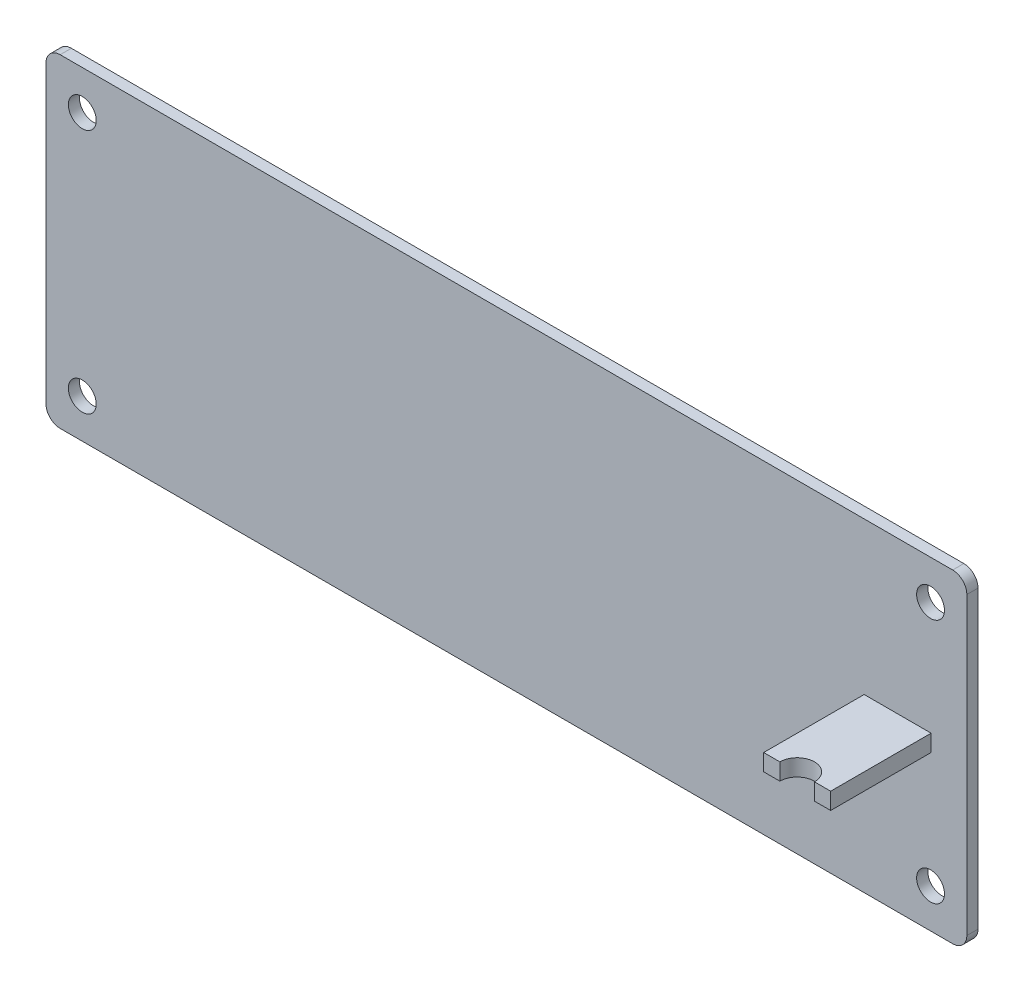
ISO-10303-21;
HEADER;
FILE_DESCRIPTION(('STEP AP214'),'2;1');
FILE_NAME('part.step','',(''),(''),'','','');
FILE_SCHEMA(('AUTOMOTIVE_DESIGN { 1 0 10303 214 1 1 1 1 }'));
ENDSEC;
DATA;
#1=APPLICATION_CONTEXT('core data for automotive mechanical design processes');
#2=APPLICATION_PROTOCOL_DEFINITION('international standard','automotive_design',2000,#1);
#3=PRODUCT_CONTEXT('',#1,'mechanical');
#4=PRODUCT('Part','Part','',(#3));
#5=PRODUCT_RELATED_PRODUCT_CATEGORY('part','',(#4));
#6=PRODUCT_DEFINITION_FORMATION('','',#4);
#7=PRODUCT_DEFINITION_CONTEXT('part definition',#1,'design');
#8=PRODUCT_DEFINITION('design','',#6,#7);
#9=PRODUCT_DEFINITION_SHAPE('','',#8);
#10=(LENGTH_UNIT() NAMED_UNIT(*) SI_UNIT(.MILLI.,.METRE.));
#11=(NAMED_UNIT(*) PLANE_ANGLE_UNIT() SI_UNIT($,.RADIAN.));
#12=(NAMED_UNIT(*) SI_UNIT($,.STERADIAN.) SOLID_ANGLE_UNIT());
#13=UNCERTAINTY_MEASURE_WITH_UNIT(LENGTH_MEASURE(1.E-05),#10,'distance_accuracy_value','');
#14=(GEOMETRIC_REPRESENTATION_CONTEXT(3) GLOBAL_UNCERTAINTY_ASSIGNED_CONTEXT((#13)) GLOBAL_UNIT_ASSIGNED_CONTEXT((#10,
#11,#12)) REPRESENTATION_CONTEXT('',''));
#15=CARTESIAN_POINT('',(0.,0.,0.));
#16=DIRECTION('',(0.,0.,1.));
#17=DIRECTION('',(1.,0.,0.));
#18=AXIS2_PLACEMENT_3D('',#15,#16,#17);
#19=CARTESIAN_POINT('',(79.2998064813246,15.3727846275138,1.00000000000006));
#20=DIRECTION('',(1.,0.,0.));
#21=DIRECTION('',(0.,0.,-1.));
#22=AXIS2_PLACEMENT_3D('',#19,#20,#21);
#23=PLANE('',#22);
#24=DIRECTION('',(0.,0.,1.));
#25=VECTOR('',#24,1.);
#26=CARTESIAN_POINT('',(79.2998064813246,15.3727846275138,1.00000000000006));
#27=LINE('',#26,#25);
#28=CARTESIAN_POINT('',(79.2998064813246,15.3727846275138,10.0000000000006));
#29=VERTEX_POINT('',#28);
#30=CARTESIAN_POINT('',(79.2998064813246,15.3727846275138,1.00000000000006));
#31=VERTEX_POINT('',#30);
#32=EDGE_CURVE('E138',#29,#31,#27,.F.);
#33=ORIENTED_EDGE('',*,*,#32,.F.);
#34=DIRECTION('',(0.,1.,0.));
#35=VECTOR('',#34,1.);
#36=CARTESIAN_POINT('',(79.2998064813246,15.3727846275138,10.0000000000006));
#37=LINE('',#36,#35);
#38=CARTESIAN_POINT('',(79.2998064813246,13.8727846275147,10.0000000000006));
#39=VERTEX_POINT('',#38);
#40=EDGE_CURVE('E252',#29,#39,#37,.F.);
#41=ORIENTED_EDGE('',*,*,#40,.T.);
#42=DIRECTION('',(0.,0.,-1.));
#43=VECTOR('',#42,1.);
#44=CARTESIAN_POINT('',(79.2998064813246,13.8727846275147,1.00000000000006));
#45=LINE('',#44,#43);
#46=CARTESIAN_POINT('',(79.2998064813246,13.8727846275147,1.00000000000006));
#47=VERTEX_POINT('',#46);
#48=EDGE_CURVE('E139',#47,#39,#45,.F.);
#49=ORIENTED_EDGE('',*,*,#48,.F.);
#50=DIRECTION('',(0.,1.,0.));
#51=VECTOR('',#50,1.);
#52=CARTESIAN_POINT('',(79.2998064813246,15.3727846275138,1.00000000000006));
#53=LINE('',#52,#51);
#54=EDGE_CURVE('E135',#47,#31,#53,.T.);
#55=ORIENTED_EDGE('',*,*,#54,.T.);
#56=EDGE_LOOP('',(#33,#41,#49,#55));
#57=FACE_BOUND('',#56,.T.);
#58=ADVANCED_FACE('F19',(#57),#23,.T.);
#59=CARTESIAN_POINT('',(73.2998064813232,13.8727846275147,1.00000000000006));
#60=DIRECTION('',(-1.,0.,0.));
#61=DIRECTION('',(0.,0.,1.));
#62=AXIS2_PLACEMENT_3D('',#59,#60,#61);
#63=PLANE('',#62);
#64=DIRECTION('',(0.,0.,-1.));
#65=VECTOR('',#64,1.);
#66=CARTESIAN_POINT('',(73.2998064813232,13.8727846275147,1.00000000000006));
#67=LINE('',#66,#65);
#68=CARTESIAN_POINT('',(73.2998064813232,13.8727846275147,10.0000000000006));
#69=VERTEX_POINT('',#68);
#70=CARTESIAN_POINT('',(73.2998064813232,13.8727846275147,1.00000000000006));
#71=VERTEX_POINT('',#70);
#72=EDGE_CURVE('E174',#69,#71,#67,.T.);
#73=ORIENTED_EDGE('',*,*,#72,.F.);
#74=DIRECTION('',(0.,1.,0.));
#75=VECTOR('',#74,1.);
#76=CARTESIAN_POINT('',(73.2998064813232,15.3727846275138,10.0000000000006));
#77=LINE('',#76,#75);
#78=CARTESIAN_POINT('',(73.2998064813232,15.3727846275138,10.0000000000006));
#79=VERTEX_POINT('',#78);
#80=EDGE_CURVE('E117',#69,#79,#77,.T.);
#81=ORIENTED_EDGE('',*,*,#80,.T.);
#82=DIRECTION('',(0.,0.,1.));
#83=VECTOR('',#82,1.);
#84=CARTESIAN_POINT('',(73.2998064813232,15.3727846275138,1.00000000000006));
#85=LINE('',#84,#83);
#86=CARTESIAN_POINT('',(73.2998064813232,15.3727846275138,1.00000000000006));
#87=VERTEX_POINT('',#86);
#88=EDGE_CURVE('E153',#87,#79,#85,.T.);
#89=ORIENTED_EDGE('',*,*,#88,.F.);
#90=DIRECTION('',(0.,1.,0.));
#91=VECTOR('',#90,1.);
#92=CARTESIAN_POINT('',(73.2998064813232,13.8727846275147,1.00000000000006));
#93=LINE('',#92,#91);
#94=EDGE_CURVE('E144',#87,#71,#93,.F.);
#95=ORIENTED_EDGE('',*,*,#94,.T.);
#96=EDGE_LOOP('',(#73,#81,#89,#95));
#97=FACE_BOUND('',#96,.T.);
#98=ADVANCED_FACE('F265',(#97),#63,.T.);
#99=CARTESIAN_POINT('',(81.85100113384,15.3727846275138,10.0000000000006));
#100=DIRECTION('',(0.,0.,-1.));
#101=DIRECTION('',(-1.,0.,0.));
#102=AXIS2_PLACEMENT_3D('',#99,#100,#101);
#103=PLANE('',#102);
#104=DIRECTION('',(1.,0.,0.));
#105=VECTOR('',#104,1.);
#106=CARTESIAN_POINT('',(73.2998064813232,15.3727846275138,10.0000000000006));
#107=LINE('',#106,#105);
#108=CARTESIAN_POINT('',(74.7498064813367,15.3727846275138,10.0000000000006));
#109=VERTEX_POINT('',#108);
#110=EDGE_CURVE('E236',#79,#109,#107,.T.);
#111=ORIENTED_EDGE('',*,*,#110,.F.);
#112=ORIENTED_EDGE('',*,*,#80,.F.);
#113=DIRECTION('',(1.,0.,0.));
#114=VECTOR('',#113,1.);
#115=CARTESIAN_POINT('',(79.2998064813246,13.8727846275147,10.0000000000006));
#116=LINE('',#115,#114);
#117=CARTESIAN_POINT('',(74.7498064813367,13.8727846275147,10.0000000000006));
#118=VERTEX_POINT('',#117);
#119=EDGE_CURVE('E181',#118,#69,#116,.F.);
#120=ORIENTED_EDGE('',*,*,#119,.F.);
#121=DIRECTION('',(0.,-1.,0.));
#122=VECTOR('',#121,1.);
#123=CARTESIAN_POINT('',(74.7498064813367,15.3727846275138,10.0000000000006));
#124=LINE('',#123,#122);
#125=EDGE_CURVE('E108',#118,#109,#124,.F.);
#126=ORIENTED_EDGE('',*,*,#125,.T.);
#127=EDGE_LOOP('',(#111,#112,#120,#126));
#128=FACE_BOUND('',#127,.T.);
#129=ADVANCED_FACE('F268',(#128),#103,.F.);
#130=CARTESIAN_POINT('',(76.2998064813366,15.3727846275138,10.0000000000006));
#131=DIRECTION('',(0.,-1.,0.));
#132=DIRECTION('',(0.,0.,-1.));
#133=AXIS2_PLACEMENT_3D('',#130,#131,#132);
#134=CYLINDRICAL_SURFACE('',#133,1.5499999999999);
#135=CARTESIAN_POINT('',(76.2998064813366,15.3727846275138,10.0000000000006));
#136=DIRECTION('',(0.,-1.,0.));
#137=DIRECTION('',(0.,0.,-1.));
#138=AXIS2_PLACEMENT_3D('',#135,#136,#137);
#139=CIRCLE('',#138,1.5499999999999);
#140=CARTESIAN_POINT('',(77.8498064813334,15.3727846275138,10.0000000000006));
#141=VERTEX_POINT('',#140);
#142=EDGE_CURVE('E235',#109,#141,#139,.T.);
#143=ORIENTED_EDGE('',*,*,#142,.F.);
#144=ORIENTED_EDGE('',*,*,#125,.F.);
#145=CARTESIAN_POINT('',(76.2998064813366,13.8727846275147,10.0000000000006));
#146=DIRECTION('',(0.,-1.,0.));
#147=DIRECTION('',(0.,0.,-1.));
#148=AXIS2_PLACEMENT_3D('',#145,#146,#147);
#149=CIRCLE('',#148,1.5499999999999);
#150=CARTESIAN_POINT('',(77.8498064813334,13.8727846275147,10.0000000000006));
#151=VERTEX_POINT('',#150);
#152=EDGE_CURVE('E22',#151,#118,#149,.F.);
#153=ORIENTED_EDGE('',*,*,#152,.F.);
#154=DIRECTION('',(0.,1.,0.));
#155=VECTOR('',#154,1.);
#156=CARTESIAN_POINT('',(77.8498064813304,15.3727846275138,10.0000000000006));
#157=LINE('',#156,#155);
#158=EDGE_CURVE('E100',#151,#141,#157,.T.);
#159=ORIENTED_EDGE('',*,*,#158,.T.);
#160=EDGE_LOOP('',(#143,#144,#153,#159));
#161=FACE_BOUND('',#160,.T.);
#162=ADVANCED_FACE('F269',(#161),#134,.F.);
#163=CARTESIAN_POINT('',(81.85100113384,15.3727846275138,10.0000000000006));
#164=DIRECTION('',(0.,0.,-1.));
#165=DIRECTION('',(-1.,0.,0.));
#166=AXIS2_PLACEMENT_3D('',#163,#164,#165);
#167=PLANE('',#166);
#168=DIRECTION('',(1.,0.,0.));
#169=VECTOR('',#168,1.);
#170=CARTESIAN_POINT('',(73.2998064813232,15.3727846275138,10.0000000000006));
#171=LINE('',#170,#169);
#172=EDGE_CURVE('E152',#141,#29,#171,.T.);
#173=ORIENTED_EDGE('',*,*,#172,.F.);
#174=ORIENTED_EDGE('',*,*,#158,.F.);
#175=DIRECTION('',(1.,0.,0.));
#176=VECTOR('',#175,1.);
#177=CARTESIAN_POINT('',(79.2998064813246,13.8727846275147,10.0000000000006));
#178=LINE('',#177,#176);
#179=EDGE_CURVE('E154',#39,#151,#178,.F.);
#180=ORIENTED_EDGE('',*,*,#179,.F.);
#181=ORIENTED_EDGE('',*,*,#40,.F.);
#182=EDGE_LOOP('',(#173,#174,#180,#181));
#183=FACE_BOUND('',#182,.T.);
#184=ADVANCED_FACE('F271',(#183),#167,.F.);
#185=CARTESIAN_POINT('',(79.2998064813246,13.8727846275147,1.00000000000006));
#186=DIRECTION('',(0.,-1.,0.));
#187=DIRECTION('',(0.,0.,-1.));
#188=AXIS2_PLACEMENT_3D('',#185,#186,#187);
#189=PLANE('',#188);
#190=ORIENTED_EDGE('',*,*,#48,.T.);
#191=ORIENTED_EDGE('',*,*,#179,.T.);
#192=ORIENTED_EDGE('',*,*,#152,.T.);
#193=ORIENTED_EDGE('',*,*,#119,.T.);
#194=ORIENTED_EDGE('',*,*,#72,.T.);
#195=DIRECTION('',(1.,0.,0.));
#196=VECTOR('',#195,1.);
#197=CARTESIAN_POINT('',(41.2499999999874,13.8727846275147,1.00000000000006));
#198=LINE('',#197,#196);
#199=EDGE_CURVE('E160',#47,#71,#198,.F.);
#200=ORIENTED_EDGE('',*,*,#199,.F.);
#201=EDGE_LOOP('',(#190,#191,#192,#193,#194,#200));
#202=FACE_BOUND('',#201,.T.);
#203=ADVANCED_FACE('F267',(#202),#189,.T.);
#204=CARTESIAN_POINT('',(73.2998064813232,15.3727846275138,1.00000000000006));
#205=DIRECTION('',(0.,1.,0.));
#206=DIRECTION('',(0.,0.,1.));
#207=AXIS2_PLACEMENT_3D('',#204,#205,#206);
#208=PLANE('',#207);
#209=ORIENTED_EDGE('',*,*,#142,.T.);
#210=ORIENTED_EDGE('',*,*,#172,.T.);
#211=ORIENTED_EDGE('',*,*,#32,.T.);
#212=DIRECTION('',(1.,0.,0.));
#213=VECTOR('',#212,1.);
#214=CARTESIAN_POINT('',(41.2499999999874,15.3727846275138,1.00000000000006));
#215=LINE('',#214,#213);
#216=EDGE_CURVE('E151',#87,#31,#215,.T.);
#217=ORIENTED_EDGE('',*,*,#216,.F.);
#218=ORIENTED_EDGE('',*,*,#88,.T.);
#219=ORIENTED_EDGE('',*,*,#110,.T.);
#220=EDGE_LOOP('',(#209,#210,#211,#217,#218,#219));
#221=FACE_BOUND('',#220,.T.);
#222=ADVANCED_FACE('F149',(#221),#208,.T.);
#223=CARTESIAN_POINT('',(41.2499999999874,14.5000000000004,1.00000000000006));
#224=DIRECTION('',(0.,0.,1.));
#225=DIRECTION('',(1.,0.,0.));
#226=AXIS2_PLACEMENT_3D('',#223,#224,#225);
#227=PLANE('',#226);
#228=CARTESIAN_POINT('',(3.2499999999997,3.50000000000124,1.00000000000006));
#229=DIRECTION('',(0.,0.,1.));
#230=DIRECTION('',(1.,0.,0.));
#231=AXIS2_PLACEMENT_3D('',#228,#229,#230);
#232=CIRCLE('',#231,1.25000000000008);
#233=CARTESIAN_POINT('',(4.49999999999978,3.50000000000124,1.00000000000006));
#234=VERTEX_POINT('',#233);
#235=EDGE_CURVE('E207',#234,#234,#232,.F.);
#236=ORIENTED_EDGE('',*,*,#235,.T.);
#237=EDGE_LOOP('',(#236));
#238=FACE_BOUND('',#237,.T.);
#239=CARTESIAN_POINT('',(3.2499999999997,25.4999999999996,1.00000000000006));
#240=DIRECTION('',(0.,0.,1.));
#241=DIRECTION('',(1.,0.,0.));
#242=AXIS2_PLACEMENT_3D('',#239,#240,#241);
#243=CIRCLE('',#242,1.25000000000008);
#244=CARTESIAN_POINT('',(4.49999999999978,25.4999999999996,1.00000000000006));
#245=VERTEX_POINT('',#244);
#246=EDGE_CURVE('E210',#245,#245,#243,.F.);
#247=ORIENTED_EDGE('',*,*,#246,.T.);
#248=EDGE_LOOP('',(#247));
#249=FACE_BOUND('',#248,.T.);
#250=CARTESIAN_POINT('',(79.2499999999878,3.50000000000124,1.00000000000006));
#251=DIRECTION('',(0.,0.,1.));
#252=DIRECTION('',(1.,0.,0.));
#253=AXIS2_PLACEMENT_3D('',#250,#251,#252);
#254=CIRCLE('',#253,1.25000000000008);
#255=CARTESIAN_POINT('',(80.4999999999879,3.50000000000124,1.00000000000006));
#256=VERTEX_POINT('',#255);
#257=EDGE_CURVE('E213',#256,#256,#254,.F.);
#258=ORIENTED_EDGE('',*,*,#257,.T.);
#259=EDGE_LOOP('',(#258));
#260=FACE_BOUND('',#259,.T.);
#261=CARTESIAN_POINT('',(79.2499999999878,25.4999999999996,1.00000000000006));
#262=DIRECTION('',(0.,0.,1.));
#263=DIRECTION('',(1.,0.,0.));
#264=AXIS2_PLACEMENT_3D('',#261,#262,#263);
#265=CIRCLE('',#264,1.25000000000008);
#266=CARTESIAN_POINT('',(80.4999999999879,25.4999999999996,1.00000000000006));
#267=VERTEX_POINT('',#266);
#268=EDGE_CURVE('E216',#267,#267,#265,.F.);
#269=ORIENTED_EDGE('',*,*,#268,.T.);
#270=EDGE_LOOP('',(#269));
#271=FACE_BOUND('',#270,.T.);
#272=ORIENTED_EDGE('',*,*,#216,.T.);
#273=ORIENTED_EDGE('',*,*,#54,.F.);
#274=ORIENTED_EDGE('',*,*,#199,.T.);
#275=ORIENTED_EDGE('',*,*,#94,.F.);
#276=EDGE_LOOP('',(#272,#273,#274,#275));
#277=FACE_BOUND('',#276,.T.);
#278=DIRECTION('',(1.,0.,0.));
#279=VECTOR('',#278,1.);
#280=CARTESIAN_POINT('',(1.27,29.000000000011,1.00000000000006));
#281=LINE('',#280,#279);
#282=CARTESIAN_POINT('',(1.27,29.000000000011,1.00000000000006));
#283=VERTEX_POINT('',#282);
#284=CARTESIAN_POINT('',(81.2300000000002,29.000000000011,1.00000000000006));
#285=VERTEX_POINT('',#284);
#286=EDGE_CURVE('E494',#283,#285,#281,.T.);
#287=ORIENTED_EDGE('',*,*,#286,.F.);
#288=CARTESIAN_POINT('',(1.27,27.730000000011,1.00000000000006));
#289=DIRECTION('',(0.,0.,1.));
#290=DIRECTION('',(1.,0.,0.));
#291=AXIS2_PLACEMENT_3D('',#288,#289,#290);
#292=CIRCLE('',#291,1.27);
#293=CARTESIAN_POINT('',(0.,27.730000000011,1.00000000000006));
#294=VERTEX_POINT('',#293);
#295=EDGE_CURVE('E219',#294,#283,#292,.F.);
#296=ORIENTED_EDGE('',*,*,#295,.F.);
#297=DIRECTION('',(0.,1.,0.));
#298=VECTOR('',#297,1.);
#299=CARTESIAN_POINT('',(0.,1.27,1.00000000000006));
#300=LINE('',#299,#298);
#301=CARTESIAN_POINT('',(0.,1.27,1.00000000000006));
#302=VERTEX_POINT('',#301);
#303=EDGE_CURVE('E159',#302,#294,#300,.T.);
#304=ORIENTED_EDGE('',*,*,#303,.F.);
#305=CARTESIAN_POINT('',(1.27,1.27,1.00000000000006));
#306=DIRECTION('',(0.,0.,1.));
#307=DIRECTION('',(1.,0.,0.));
#308=AXIS2_PLACEMENT_3D('',#305,#306,#307);
#309=CIRCLE('',#308,1.27);
#310=CARTESIAN_POINT('',(1.27,0.,1.00000000000006));
#311=VERTEX_POINT('',#310);
#312=EDGE_CURVE('E232',#311,#302,#309,.F.);
#313=ORIENTED_EDGE('',*,*,#312,.F.);
#314=DIRECTION('',(1.,0.,0.));
#315=VECTOR('',#314,1.);
#316=CARTESIAN_POINT('',(81.2300000000002,0.,1.00000000000006));
#317=LINE('',#316,#315);
#318=CARTESIAN_POINT('',(81.2300000000002,0.,1.00000000000006));
#319=VERTEX_POINT('',#318);
#320=EDGE_CURVE('E500',#319,#311,#317,.F.);
#321=ORIENTED_EDGE('',*,*,#320,.F.);
#322=CARTESIAN_POINT('',(81.2300000000002,1.27,1.00000000000006));
#323=DIRECTION('',(0.,0.,1.));
#324=DIRECTION('',(1.,0.,0.));
#325=AXIS2_PLACEMENT_3D('',#322,#323,#324);
#326=CIRCLE('',#325,1.27);
#327=CARTESIAN_POINT('',(82.5000000000002,1.27,1.00000000000006));
#328=VERTEX_POINT('',#327);
#329=EDGE_CURVE('E227',#328,#319,#326,.F.);
#330=ORIENTED_EDGE('',*,*,#329,.F.);
#331=DIRECTION('',(0.,1.,0.));
#332=VECTOR('',#331,1.);
#333=CARTESIAN_POINT('',(82.5000000000002,27.730000000011,1.00000000000006));
#334=LINE('',#333,#332);
#335=CARTESIAN_POINT('',(82.5000000000002,27.730000000011,1.00000000000006));
#336=VERTEX_POINT('',#335);
#337=EDGE_CURVE('E497',#336,#328,#334,.F.);
#338=ORIENTED_EDGE('',*,*,#337,.F.);
#339=CARTESIAN_POINT('',(81.2300000000002,27.730000000011,1.00000000000006));
#340=DIRECTION('',(0.,0.,1.));
#341=DIRECTION('',(1.,0.,0.));
#342=AXIS2_PLACEMENT_3D('',#339,#340,#341);
#343=CIRCLE('',#342,1.27);
#344=EDGE_CURVE('E222',#285,#336,#343,.F.);
#345=ORIENTED_EDGE('',*,*,#344,.F.);
#346=EDGE_LOOP('',(#287,#296,#304,#313,#321,#330,#338,#345));
#347=FACE_BOUND('',#346,.T.);
#348=ADVANCED_FACE('F156',(#238,#249,#260,#271,#277,#347),#227,.T.);
#349=CARTESIAN_POINT('',(0.,1.27,0.));
#350=DIRECTION('',(-1.,0.,0.));
#351=DIRECTION('',(0.,0.,1.));
#352=AXIS2_PLACEMENT_3D('',#349,#350,#351);
#353=PLANE('',#352);
#354=DIRECTION('',(0.,0.,1.));
#355=VECTOR('',#354,1.);
#356=CARTESIAN_POINT('',(0.,1.27,0.));
#357=LINE('',#356,#355);
#358=CARTESIAN_POINT('',(0.,1.27,0.));
#359=VERTEX_POINT('',#358);
#360=EDGE_CURVE('E162',#302,#359,#357,.F.);
#361=ORIENTED_EDGE('',*,*,#360,.F.);
#362=ORIENTED_EDGE('',*,*,#303,.T.);
#363=DIRECTION('',(0.,0.,1.));
#364=VECTOR('',#363,1.);
#365=CARTESIAN_POINT('',(0.,27.730000000011,0.));
#366=LINE('',#365,#364);
#367=CARTESIAN_POINT('',(0.,27.730000000011,0.));
#368=VERTEX_POINT('',#367);
#369=EDGE_CURVE('E221',#368,#294,#366,.T.);
#370=ORIENTED_EDGE('',*,*,#369,.F.);
#371=DIRECTION('',(0.,1.,0.));
#372=VECTOR('',#371,1.);
#373=CARTESIAN_POINT('',(0.,14.5000000000004,0.));
#374=LINE('',#373,#372);
#375=EDGE_CURVE('E206',#368,#359,#374,.F.);
#376=ORIENTED_EDGE('',*,*,#375,.T.);
#377=EDGE_LOOP('',(#361,#362,#370,#376));
#378=FACE_BOUND('',#377,.T.);
#379=ADVANCED_FACE('F332',(#378),#353,.T.);
#380=CARTESIAN_POINT('',(1.27,1.27,0.));
#381=DIRECTION('',(0.,0.,1.));
#382=DIRECTION('',(1.,0.,0.));
#383=AXIS2_PLACEMENT_3D('',#380,#381,#382);
#384=CYLINDRICAL_SURFACE('',#383,1.27);
#385=DIRECTION('',(0.,0.,-1.));
#386=VECTOR('',#385,1.);
#387=CARTESIAN_POINT('',(1.26999999999999,0.,0.));
#388=LINE('',#387,#386);
#389=CARTESIAN_POINT('',(1.27,0.,0.));
#390=VERTEX_POINT('',#389);
#391=EDGE_CURVE('E234',#311,#390,#388,.T.);
#392=ORIENTED_EDGE('',*,*,#391,.F.);
#393=ORIENTED_EDGE('',*,*,#312,.T.);
#394=ORIENTED_EDGE('',*,*,#360,.T.);
#395=CARTESIAN_POINT('',(1.27,1.27,0.));
#396=DIRECTION('',(0.,0.,1.));
#397=DIRECTION('',(1.,0.,0.));
#398=AXIS2_PLACEMENT_3D('',#395,#396,#397);
#399=CIRCLE('',#398,1.27);
#400=EDGE_CURVE('E203',#359,#390,#399,.T.);
#401=ORIENTED_EDGE('',*,*,#400,.T.);
#402=EDGE_LOOP('',(#392,#393,#394,#401));
#403=FACE_BOUND('',#402,.T.);
#404=ADVANCED_FACE('F328',(#403),#384,.T.);
#405=CARTESIAN_POINT('',(81.2300000000002,0.,0.));
#406=DIRECTION('',(0.,-1.,0.));
#407=DIRECTION('',(0.,0.,-1.));
#408=AXIS2_PLACEMENT_3D('',#405,#406,#407);
#409=PLANE('',#408);
#410=DIRECTION('',(0.,0.,1.));
#411=VECTOR('',#410,1.);
#412=CARTESIAN_POINT('',(81.2300000000002,0.,0.));
#413=LINE('',#412,#411);
#414=CARTESIAN_POINT('',(81.2300000000002,0.,0.));
#415=VERTEX_POINT('',#414);
#416=EDGE_CURVE('E231',#319,#415,#413,.F.);
#417=ORIENTED_EDGE('',*,*,#416,.F.);
#418=ORIENTED_EDGE('',*,*,#320,.T.);
#419=ORIENTED_EDGE('',*,*,#391,.T.);
#420=DIRECTION('',(1.,0.,0.));
#421=VECTOR('',#420,1.);
#422=CARTESIAN_POINT('',(41.2499999999874,0.,0.));
#423=LINE('',#422,#421);
#424=EDGE_CURVE('E202',#390,#415,#423,.T.);
#425=ORIENTED_EDGE('',*,*,#424,.T.);
#426=EDGE_LOOP('',(#417,#418,#419,#425));
#427=FACE_BOUND('',#426,.T.);
#428=ADVANCED_FACE('F324',(#427),#409,.T.);
#429=CARTESIAN_POINT('',(81.2300000000002,1.27,0.));
#430=DIRECTION('',(0.,0.,1.));
#431=DIRECTION('',(1.,0.,0.));
#432=AXIS2_PLACEMENT_3D('',#429,#430,#431);
#433=CYLINDRICAL_SURFACE('',#432,1.27);
#434=DIRECTION('',(0.,0.,-1.));
#435=VECTOR('',#434,1.);
#436=CARTESIAN_POINT('',(82.5000000000002,1.27,0.));
#437=LINE('',#436,#435);
#438=CARTESIAN_POINT('',(82.5000000000002,1.27,0.));
#439=VERTEX_POINT('',#438);
#440=EDGE_CURVE('E230',#328,#439,#437,.T.);
#441=ORIENTED_EDGE('',*,*,#440,.F.);
#442=ORIENTED_EDGE('',*,*,#329,.T.);
#443=ORIENTED_EDGE('',*,*,#416,.T.);
#444=CARTESIAN_POINT('',(81.2300000000002,1.27,0.));
#445=DIRECTION('',(0.,0.,1.));
#446=DIRECTION('',(1.,0.,0.));
#447=AXIS2_PLACEMENT_3D('',#444,#445,#446);
#448=CIRCLE('',#447,1.27);
#449=EDGE_CURVE('E199',#415,#439,#448,.T.);
#450=ORIENTED_EDGE('',*,*,#449,.T.);
#451=EDGE_LOOP('',(#441,#442,#443,#450));
#452=FACE_BOUND('',#451,.T.);
#453=ADVANCED_FACE('F320',(#452),#433,.T.);
#454=CARTESIAN_POINT('',(82.5000000000002,27.730000000011,0.));
#455=DIRECTION('',(1.,0.,0.));
#456=DIRECTION('',(0.,0.,-1.));
#457=AXIS2_PLACEMENT_3D('',#454,#455,#456);
#458=PLANE('',#457);
#459=DIRECTION('',(0.,0.,1.));
#460=VECTOR('',#459,1.);
#461=CARTESIAN_POINT('',(82.5000000000002,27.730000000011,0.));
#462=LINE('',#461,#460);
#463=CARTESIAN_POINT('',(82.5000000000002,27.730000000011,0.));
#464=VERTEX_POINT('',#463);
#465=EDGE_CURVE('E226',#336,#464,#462,.F.);
#466=ORIENTED_EDGE('',*,*,#465,.F.);
#467=ORIENTED_EDGE('',*,*,#337,.T.);
#468=ORIENTED_EDGE('',*,*,#440,.T.);
#469=DIRECTION('',(0.,1.,0.));
#470=VECTOR('',#469,1.);
#471=CARTESIAN_POINT('',(82.5000000000002,14.5000000000004,0.));
#472=LINE('',#471,#470);
#473=EDGE_CURVE('E198',#439,#464,#472,.T.);
#474=ORIENTED_EDGE('',*,*,#473,.T.);
#475=EDGE_LOOP('',(#466,#467,#468,#474));
#476=FACE_BOUND('',#475,.T.);
#477=ADVANCED_FACE('F316',(#476),#458,.T.);
#478=CARTESIAN_POINT('',(81.2300000000002,27.730000000011,0.));
#479=DIRECTION('',(0.,0.,1.));
#480=DIRECTION('',(1.,0.,0.));
#481=AXIS2_PLACEMENT_3D('',#478,#479,#480);
#482=CYLINDRICAL_SURFACE('',#481,1.27);
#483=DIRECTION('',(0.,0.,1.));
#484=VECTOR('',#483,1.);
#485=CARTESIAN_POINT('',(81.2300000000002,29.000000000011,0.));
#486=LINE('',#485,#484);
#487=CARTESIAN_POINT('',(81.2300000000002,29.000000000011,0.));
#488=VERTEX_POINT('',#487);
#489=EDGE_CURVE('E225',#285,#488,#486,.F.);
#490=ORIENTED_EDGE('',*,*,#489,.F.);
#491=ORIENTED_EDGE('',*,*,#344,.T.);
#492=ORIENTED_EDGE('',*,*,#465,.T.);
#493=CARTESIAN_POINT('',(81.2300000000002,27.730000000011,0.));
#494=DIRECTION('',(0.,0.,1.));
#495=DIRECTION('',(1.,0.,0.));
#496=AXIS2_PLACEMENT_3D('',#493,#494,#495);
#497=CIRCLE('',#496,1.27);
#498=EDGE_CURVE('E195',#464,#488,#497,.T.);
#499=ORIENTED_EDGE('',*,*,#498,.T.);
#500=EDGE_LOOP('',(#490,#491,#492,#499));
#501=FACE_BOUND('',#500,.T.);
#502=ADVANCED_FACE('F312',(#501),#482,.T.);
#503=CARTESIAN_POINT('',(1.27,29.000000000011,0.));
#504=DIRECTION('',(0.,1.,0.));
#505=DIRECTION('',(0.,0.,1.));
#506=AXIS2_PLACEMENT_3D('',#503,#504,#505);
#507=PLANE('',#506);
#508=DIRECTION('',(0.,0.,1.));
#509=VECTOR('',#508,1.);
#510=CARTESIAN_POINT('',(1.27,29.000000000011,0.));
#511=LINE('',#510,#509);
#512=CARTESIAN_POINT('',(1.27,29.000000000011,0.));
#513=VERTEX_POINT('',#512);
#514=EDGE_CURVE('E37',#283,#513,#511,.F.);
#515=ORIENTED_EDGE('',*,*,#514,.F.);
#516=ORIENTED_EDGE('',*,*,#286,.T.);
#517=ORIENTED_EDGE('',*,*,#489,.T.);
#518=DIRECTION('',(1.,0.,0.));
#519=VECTOR('',#518,1.);
#520=CARTESIAN_POINT('',(41.2499999999874,29.000000000011,0.));
#521=LINE('',#520,#519);
#522=EDGE_CURVE('E194',#488,#513,#521,.F.);
#523=ORIENTED_EDGE('',*,*,#522,.T.);
#524=EDGE_LOOP('',(#515,#516,#517,#523));
#525=FACE_BOUND('',#524,.T.);
#526=ADVANCED_FACE('F309',(#525),#507,.T.);
#527=CARTESIAN_POINT('',(1.27,27.730000000011,0.));
#528=DIRECTION('',(0.,0.,1.));
#529=DIRECTION('',(1.,0.,0.));
#530=AXIS2_PLACEMENT_3D('',#527,#528,#529);
#531=CYLINDRICAL_SURFACE('',#530,1.27);
#532=ORIENTED_EDGE('',*,*,#369,.T.);
#533=ORIENTED_EDGE('',*,*,#295,.T.);
#534=ORIENTED_EDGE('',*,*,#514,.T.);
#535=CARTESIAN_POINT('',(1.27,27.730000000011,0.));
#536=DIRECTION('',(0.,0.,1.));
#537=DIRECTION('',(1.,0.,0.));
#538=AXIS2_PLACEMENT_3D('',#535,#536,#537);
#539=CIRCLE('',#538,1.27);
#540=EDGE_CURVE('E192',#513,#368,#539,.T.);
#541=ORIENTED_EDGE('',*,*,#540,.T.);
#542=EDGE_LOOP('',(#532,#533,#534,#541));
#543=FACE_BOUND('',#542,.T.);
#544=ADVANCED_FACE('F305',(#543),#531,.T.);
#545=CARTESIAN_POINT('',(79.2499999999878,25.4999999999996,0.));
#546=DIRECTION('',(0.,0.,1.));
#547=DIRECTION('',(1.,0.,0.));
#548=AXIS2_PLACEMENT_3D('',#545,#546,#547);
#549=CYLINDRICAL_SURFACE('',#548,1.25000000000008);
#550=CARTESIAN_POINT('',(79.2499999999878,25.4999999999996,0.));
#551=DIRECTION('',(0.,0.,1.));
#552=DIRECTION('',(1.,0.,0.));
#553=AXIS2_PLACEMENT_3D('',#550,#551,#552);
#554=CIRCLE('',#553,1.25000000000008);
#555=CARTESIAN_POINT('',(80.4999999999879,25.4999999999996,0.));
#556=VERTEX_POINT('',#555);
#557=EDGE_CURVE('E189',#556,#556,#554,.F.);
#558=ORIENTED_EDGE('',*,*,#557,.T.);
#559=EDGE_LOOP('',(#558));
#560=FACE_BOUND('',#559,.T.);
#561=ORIENTED_EDGE('',*,*,#268,.F.);
#562=EDGE_LOOP('',(#561));
#563=FACE_BOUND('',#562,.T.);
#564=ADVANCED_FACE('F301',(#560,#563),#549,.F.);
#565=CARTESIAN_POINT('',(79.2499999999878,3.50000000000124,0.));
#566=DIRECTION('',(0.,0.,1.));
#567=DIRECTION('',(1.,0.,0.));
#568=AXIS2_PLACEMENT_3D('',#565,#566,#567);
#569=CYLINDRICAL_SURFACE('',#568,1.25000000000008);
#570=CARTESIAN_POINT('',(79.2499999999878,3.50000000000124,0.));
#571=DIRECTION('',(0.,0.,1.));
#572=DIRECTION('',(1.,0.,0.));
#573=AXIS2_PLACEMENT_3D('',#570,#571,#572);
#574=CIRCLE('',#573,1.25000000000008);
#575=CARTESIAN_POINT('',(80.4999999999879,3.50000000000124,0.));
#576=VERTEX_POINT('',#575);
#577=EDGE_CURVE('E186',#576,#576,#574,.F.);
#578=ORIENTED_EDGE('',*,*,#577,.T.);
#579=EDGE_LOOP('',(#578));
#580=FACE_BOUND('',#579,.T.);
#581=ORIENTED_EDGE('',*,*,#257,.F.);
#582=EDGE_LOOP('',(#581));
#583=FACE_BOUND('',#582,.T.);
#584=ADVANCED_FACE('F297',(#580,#583),#569,.F.);
#585=CARTESIAN_POINT('',(3.2499999999997,25.4999999999996,0.));
#586=DIRECTION('',(0.,0.,1.));
#587=DIRECTION('',(1.,0.,0.));
#588=AXIS2_PLACEMENT_3D('',#585,#586,#587);
#589=CYLINDRICAL_SURFACE('',#588,1.25000000000008);
#590=CARTESIAN_POINT('',(3.2499999999997,25.4999999999996,0.));
#591=DIRECTION('',(0.,0.,1.));
#592=DIRECTION('',(1.,0.,0.));
#593=AXIS2_PLACEMENT_3D('',#590,#591,#592);
#594=CIRCLE('',#593,1.25000000000008);
#595=CARTESIAN_POINT('',(4.49999999999978,25.4999999999996,0.));
#596=VERTEX_POINT('',#595);
#597=EDGE_CURVE('E28',#596,#596,#594,.F.);
#598=ORIENTED_EDGE('',*,*,#597,.T.);
#599=EDGE_LOOP('',(#598));
#600=FACE_BOUND('',#599,.T.);
#601=ORIENTED_EDGE('',*,*,#246,.F.);
#602=EDGE_LOOP('',(#601));
#603=FACE_BOUND('',#602,.T.);
#604=ADVANCED_FACE('F289',(#600,#603),#589,.F.);
#605=CARTESIAN_POINT('',(3.2499999999997,3.50000000000124,0.));
#606=DIRECTION('',(0.,0.,1.));
#607=DIRECTION('',(1.,0.,0.));
#608=AXIS2_PLACEMENT_3D('',#605,#606,#607);
#609=CYLINDRICAL_SURFACE('',#608,1.25000000000008);
#610=CARTESIAN_POINT('',(3.2499999999997,3.50000000000124,0.));
#611=DIRECTION('',(0.,0.,1.));
#612=DIRECTION('',(1.,0.,0.));
#613=AXIS2_PLACEMENT_3D('',#610,#611,#612);
#614=CIRCLE('',#613,1.25000000000008);
#615=CARTESIAN_POINT('',(4.49999999999978,3.50000000000124,0.));
#616=VERTEX_POINT('',#615);
#617=EDGE_CURVE('E11',#616,#616,#614,.F.);
#618=ORIENTED_EDGE('',*,*,#617,.T.);
#619=EDGE_LOOP('',(#618));
#620=FACE_BOUND('',#619,.T.);
#621=ORIENTED_EDGE('',*,*,#235,.F.);
#622=EDGE_LOOP('',(#621));
#623=FACE_BOUND('',#622,.T.);
#624=ADVANCED_FACE('F283',(#620,#623),#609,.F.);
#625=CARTESIAN_POINT('',(41.2499999999874,14.5000000000004,0.));
#626=DIRECTION('',(0.,0.,1.));
#627=DIRECTION('',(1.,0.,0.));
#628=AXIS2_PLACEMENT_3D('',#625,#626,#627);
#629=PLANE('',#628);
#630=ORIENTED_EDGE('',*,*,#617,.F.);
#631=EDGE_LOOP('',(#630));
#632=FACE_BOUND('',#631,.T.);
#633=ORIENTED_EDGE('',*,*,#597,.F.);
#634=EDGE_LOOP('',(#633));
#635=FACE_BOUND('',#634,.T.);
#636=ORIENTED_EDGE('',*,*,#577,.F.);
#637=EDGE_LOOP('',(#636));
#638=FACE_BOUND('',#637,.T.);
#639=ORIENTED_EDGE('',*,*,#557,.F.);
#640=EDGE_LOOP('',(#639));
#641=FACE_BOUND('',#640,.T.);
#642=ORIENTED_EDGE('',*,*,#522,.F.);
#643=ORIENTED_EDGE('',*,*,#498,.F.);
#644=ORIENTED_EDGE('',*,*,#473,.F.);
#645=ORIENTED_EDGE('',*,*,#449,.F.);
#646=ORIENTED_EDGE('',*,*,#424,.F.);
#647=ORIENTED_EDGE('',*,*,#400,.F.);
#648=ORIENTED_EDGE('',*,*,#375,.F.);
#649=ORIENTED_EDGE('',*,*,#540,.F.);
#650=EDGE_LOOP('',(#642,#643,#644,#645,#646,#647,#648,#649));
#651=FACE_BOUND('',#650,.T.);
#652=ADVANCED_FACE('F281',(#632,#635,#638,#641,#651),#629,.F.);
#653=CLOSED_SHELL('',(#58,#98,#129,#162,#184,#203,#222,#348,#379,#404,#428,#453,#477,#502,#526,
#544,#564,#584,#604,#624,#652));
#654=MANIFOLD_SOLID_BREP('B1',#653);
#655=ADVANCED_BREP_SHAPE_REPRESENTATION('',(#18,#654),#14);
#656=SHAPE_DEFINITION_REPRESENTATION(#9,#655);
ENDSEC;
END-ISO-10303-21;
